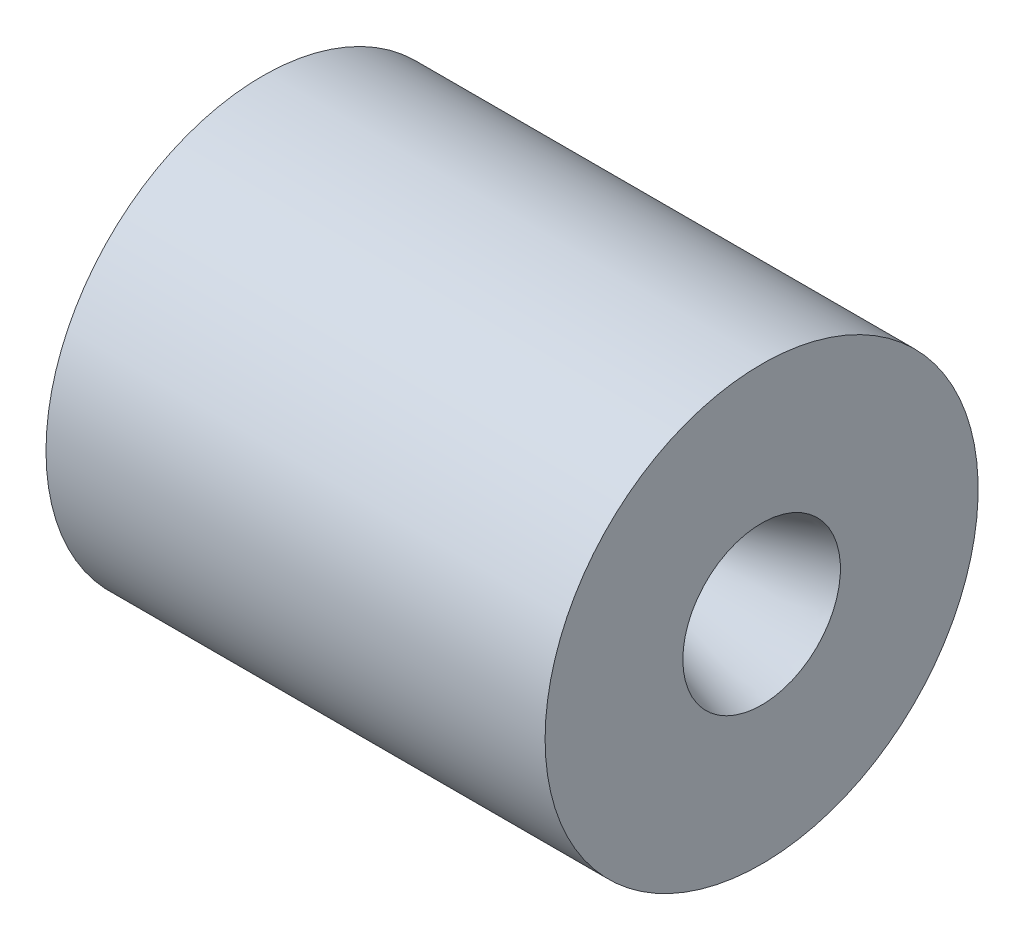
ISO-10303-21;
HEADER;
FILE_DESCRIPTION(('STEP AP214'),'2;1');
FILE_NAME('part.step','',(''),(''),'','','');
FILE_SCHEMA(('AUTOMOTIVE_DESIGN { 1 0 10303 214 1 1 1 1 }'));
ENDSEC;
DATA;
#1=APPLICATION_CONTEXT('core data for automotive mechanical design processes');
#2=APPLICATION_PROTOCOL_DEFINITION('international standard','automotive_design',2000,#1);
#3=PRODUCT_CONTEXT('',#1,'mechanical');
#4=PRODUCT('Part','Part','',(#3));
#5=PRODUCT_RELATED_PRODUCT_CATEGORY('part','',(#4));
#6=PRODUCT_DEFINITION_FORMATION('','',#4);
#7=PRODUCT_DEFINITION_CONTEXT('part definition',#1,'design');
#8=PRODUCT_DEFINITION('design','',#6,#7);
#9=PRODUCT_DEFINITION_SHAPE('','',#8);
#10=(LENGTH_UNIT() NAMED_UNIT(*) SI_UNIT(.MILLI.,.METRE.));
#11=(NAMED_UNIT(*) PLANE_ANGLE_UNIT() SI_UNIT($,.RADIAN.));
#12=(NAMED_UNIT(*) SI_UNIT($,.STERADIAN.) SOLID_ANGLE_UNIT());
#13=UNCERTAINTY_MEASURE_WITH_UNIT(LENGTH_MEASURE(1.E-05),#10,'distance_accuracy_value','');
#14=(GEOMETRIC_REPRESENTATION_CONTEXT(3) GLOBAL_UNCERTAINTY_ASSIGNED_CONTEXT((#13)) GLOBAL_UNIT_ASSIGNED_CONTEXT((#10,
#11,#12)) REPRESENTATION_CONTEXT('',''));
#15=CARTESIAN_POINT('',(0.,0.,0.));
#16=DIRECTION('',(0.,0.,1.));
#17=DIRECTION('',(1.,0.,0.));
#18=AXIS2_PLACEMENT_3D('',#15,#16,#17);
#19=CARTESIAN_POINT('',(0.,55.140272,0.));
#20=DIRECTION('',(1.,0.,0.));
#21=DIRECTION('',(0.,0.,-1.));
#22=AXIS2_PLACEMENT_3D('',#19,#20,#21);
#23=PLANE('',#22);
#24=CARTESIAN_POINT('',(0.,68.0005409151032,22.0947150978095));
#25=DIRECTION('',(-1.,0.,0.));
#26=DIRECTION('',(0.,0.,1.));
#27=AXIS2_PLACEMENT_3D('',#24,#25,#26);
#28=CIRCLE('',#27,2.57975099999999);
#29=CARTESIAN_POINT('',(0.,68.0005409151032,24.6744660978094));
#30=VERTEX_POINT('',#29);
#31=EDGE_CURVE('E114',#30,#30,#28,.T.);
#32=ORIENTED_EDGE('',*,*,#31,.F.);
#33=EDGE_LOOP('',(#32));
#34=FACE_BOUND('',#33,.T.);
#35=CARTESIAN_POINT('',(0.,71.1083155188316,-7.47378512363652));
#36=DIRECTION('',(-1.,0.,0.));
#37=DIRECTION('',(0.,0.,1.));
#38=AXIS2_PLACEMENT_3D('',#35,#36,#37);
#39=CIRCLE('',#38,2.57975099999999);
#40=CARTESIAN_POINT('',(0.,71.1083155188316,-4.89403412363653));
#41=VERTEX_POINT('',#40);
#42=EDGE_CURVE('E120',#41,#41,#39,.T.);
#43=ORIENTED_EDGE('',*,*,#42,.F.);
#44=EDGE_LOOP('',(#43));
#45=FACE_BOUND('',#44,.T.);
#46=CARTESIAN_POINT('',(0.,61.9208163705877,-35.7499999999994));
#47=DIRECTION('',(-1.,0.,0.));
#48=DIRECTION('',(0.,0.,1.));
#49=AXIS2_PLACEMENT_3D('',#46,#47,#48);
#50=CIRCLE('',#49,2.57975099999999);
#51=CARTESIAN_POINT('',(0.,61.9208163705877,-33.1702489999994));
#52=VERTEX_POINT('',#51);
#53=EDGE_CURVE('E126',#52,#52,#50,.T.);
#54=ORIENTED_EDGE('',*,*,#53,.F.);
#55=EDGE_LOOP('',(#54));
#56=FACE_BOUND('',#55,.T.);
#57=CARTESIAN_POINT('',(0.,42.0266455389123,-57.8447150978084));
#58=DIRECTION('',(-1.,0.,0.));
#59=DIRECTION('',(0.,0.,1.));
#60=AXIS2_PLACEMENT_3D('',#57,#58,#59);
#61=CIRCLE('',#60,2.57975099999999);
#62=CARTESIAN_POINT('',(0.,42.0266455389123,-55.2649640978084));
#63=VERTEX_POINT('',#62);
#64=EDGE_CURVE('E132',#63,#63,#61,.T.);
#65=ORIENTED_EDGE('',*,*,#64,.F.);
#66=EDGE_LOOP('',(#65));
#67=FACE_BOUND('',#66,.T.);
#68=CARTESIAN_POINT('',(0.,14.8656858934703,-69.937553452467));
#69=DIRECTION('',(-1.,0.,0.));
#70=DIRECTION('',(0.,0.,1.));
#71=AXIS2_PLACEMENT_3D('',#68,#69,#70);
#72=CIRCLE('',#71,2.57975099999999);
#73=CARTESIAN_POINT('',(0.,14.8656858934703,-67.357802452467));
#74=VERTEX_POINT('',#73);
#75=EDGE_CURVE('E138',#74,#74,#72,.T.);
#76=ORIENTED_EDGE('',*,*,#75,.F.);
#77=EDGE_LOOP('',(#76));
#78=FACE_BOUND('',#77,.T.);
#79=CARTESIAN_POINT('',(0.,-14.8656858934694,-69.9375534524672));
#80=DIRECTION('',(-1.,0.,0.));
#81=DIRECTION('',(0.,0.,1.));
#82=AXIS2_PLACEMENT_3D('',#79,#80,#81);
#83=CIRCLE('',#82,2.57975099999999);
#84=CARTESIAN_POINT('',(0.,-14.8656858934694,-67.3578024524672));
#85=VERTEX_POINT('',#84);
#86=EDGE_CURVE('E144',#85,#85,#83,.T.);
#87=ORIENTED_EDGE('',*,*,#86,.F.);
#88=EDGE_LOOP('',(#87));
#89=FACE_BOUND('',#88,.T.);
#90=CARTESIAN_POINT('',(0.,-42.0266455389115,-57.844715097809));
#91=DIRECTION('',(-1.,0.,0.));
#92=DIRECTION('',(0.,0.,1.));
#93=AXIS2_PLACEMENT_3D('',#90,#91,#92);
#94=CIRCLE('',#93,2.57975099999999);
#95=CARTESIAN_POINT('',(0.,-42.0266455389115,-55.264964097809));
#96=VERTEX_POINT('',#95);
#97=EDGE_CURVE('E150',#96,#96,#94,.T.);
#98=ORIENTED_EDGE('',*,*,#97,.F.);
#99=EDGE_LOOP('',(#98));
#100=FACE_BOUND('',#99,.T.);
#101=CARTESIAN_POINT('',(0.,-61.9208163705872,-35.7500000000003));
#102=DIRECTION('',(-1.,0.,0.));
#103=DIRECTION('',(0.,0.,1.));
#104=AXIS2_PLACEMENT_3D('',#101,#102,#103);
#105=CIRCLE('',#104,2.57975099999999);
#106=CARTESIAN_POINT('',(0.,-61.9208163705872,-33.1702490000003));
#107=VERTEX_POINT('',#106);
#108=EDGE_CURVE('E156',#107,#107,#105,.T.);
#109=ORIENTED_EDGE('',*,*,#108,.F.);
#110=EDGE_LOOP('',(#109));
#111=FACE_BOUND('',#110,.T.);
#112=CARTESIAN_POINT('',(0.,-71.1083155188315,-7.47378512363748));
#113=DIRECTION('',(-1.,0.,0.));
#114=DIRECTION('',(0.,0.,1.));
#115=AXIS2_PLACEMENT_3D('',#112,#113,#114);
#116=CIRCLE('',#115,2.57975099999999);
#117=CARTESIAN_POINT('',(0.,-71.1083155188315,-4.89403412363749));
#118=VERTEX_POINT('',#117);
#119=EDGE_CURVE('E162',#118,#118,#116,.T.);
#120=ORIENTED_EDGE('',*,*,#119,.F.);
#121=EDGE_LOOP('',(#120));
#122=FACE_BOUND('',#121,.T.);
#123=CARTESIAN_POINT('',(0.,-68.0005409151035,22.0947150978086));
#124=DIRECTION('',(-1.,0.,0.));
#125=DIRECTION('',(0.,0.,1.));
#126=AXIS2_PLACEMENT_3D('',#123,#124,#125);
#127=CIRCLE('',#126,2.57975099999999);
#128=CARTESIAN_POINT('',(0.,-68.0005409151035,24.6744660978086));
#129=VERTEX_POINT('',#128);
#130=EDGE_CURVE('E168',#129,#129,#127,.T.);
#131=ORIENTED_EDGE('',*,*,#130,.F.);
#132=EDGE_LOOP('',(#131));
#133=FACE_BOUND('',#132,.T.);
#134=CARTESIAN_POINT('',(0.,-53.1348550216338,47.8428383546583));
#135=DIRECTION('',(-1.,0.,0.));
#136=DIRECTION('',(0.,0.,1.));
#137=AXIS2_PLACEMENT_3D('',#134,#135,#136);
#138=CIRCLE('',#137,2.57975099999999);
#139=CARTESIAN_POINT('',(0.,-53.1348550216338,50.4225893546583));
#140=VERTEX_POINT('',#139);
#141=EDGE_CURVE('E174',#140,#140,#138,.T.);
#142=ORIENTED_EDGE('',*,*,#141,.F.);
#143=EDGE_LOOP('',(#142));
#144=FACE_BOUND('',#143,.T.);
#145=CARTESIAN_POINT('',(0.,-29.0816699799198,65.3185002214459));
#146=DIRECTION('',(-1.,0.,0.));
#147=DIRECTION('',(0.,0.,1.));
#148=AXIS2_PLACEMENT_3D('',#145,#146,#147);
#149=CIRCLE('',#148,2.57975099999999);
#150=CARTESIAN_POINT('',(0.,-29.0816699799198,67.8982512214459));
#151=VERTEX_POINT('',#150);
#152=EDGE_CURVE('E180',#151,#151,#149,.T.);
#153=ORIENTED_EDGE('',*,*,#152,.F.);
#154=EDGE_LOOP('',(#153));
#155=FACE_BOUND('',#154,.T.);
#156=CARTESIAN_POINT('',(0.,0.,71.5));
#157=DIRECTION('',(-1.,0.,0.));
#158=DIRECTION('',(0.,0.,1.));
#159=AXIS2_PLACEMENT_3D('',#156,#157,#158);
#160=CIRCLE('',#159,2.57975099999999);
#161=CARTESIAN_POINT('',(0.,0.,74.079751));
#162=VERTEX_POINT('',#161);
#163=EDGE_CURVE('E186',#162,#162,#160,.T.);
#164=ORIENTED_EDGE('',*,*,#163,.F.);
#165=EDGE_LOOP('',(#164));
#166=FACE_BOUND('',#165,.T.);
#167=CARTESIAN_POINT('',(0.,0.,0.));
#168=DIRECTION('',(-1.,0.,0.));
#169=DIRECTION('',(0.,0.,1.));
#170=AXIS2_PLACEMENT_3D('',#167,#168,#169);
#171=CIRCLE('',#170,55.140272);
#172=CARTESIAN_POINT('',(0.,0.,55.140272));
#173=VERTEX_POINT('',#172);
#174=EDGE_CURVE('E213',#173,#173,#171,.T.);
#175=ORIENTED_EDGE('',*,*,#174,.F.);
#176=EDGE_LOOP('',(#175));
#177=FACE_BOUND('',#176,.T.);
#178=CARTESIAN_POINT('',(0.,0.,0.));
#179=DIRECTION('',(-1.,0.,0.));
#180=DIRECTION('',(0.,0.,1.));
#181=AXIS2_PLACEMENT_3D('',#178,#179,#180);
#182=CIRCLE('',#181,80.540272);
#183=CARTESIAN_POINT('',(0.,0.,80.540272));
#184=VERTEX_POINT('',#183);
#185=EDGE_CURVE('E216',#184,#184,#182,.T.);
#186=ORIENTED_EDGE('',*,*,#185,.T.);
#187=EDGE_LOOP('',(#186));
#188=FACE_BOUND('',#187,.T.);
#189=CARTESIAN_POINT('',(0.,53.1348550216331,47.842838354659));
#190=DIRECTION('',(-1.,0.,0.));
#191=DIRECTION('',(0.,0.,1.));
#192=AXIS2_PLACEMENT_3D('',#189,#190,#191);
#193=CIRCLE('',#192,2.57975099999999);
#194=CARTESIAN_POINT('',(0.,53.1348550216331,50.422589354659));
#195=VERTEX_POINT('',#194);
#196=EDGE_CURVE('E103',#195,#195,#193,.T.);
#197=ORIENTED_EDGE('',*,*,#196,.F.);
#198=EDGE_LOOP('',(#197));
#199=FACE_BOUND('',#198,.T.);
#200=CARTESIAN_POINT('',(0.,29.0816699799189,65.3185002214463));
#201=DIRECTION('',(-1.,0.,0.));
#202=DIRECTION('',(0.,0.,1.));
#203=AXIS2_PLACEMENT_3D('',#200,#201,#202);
#204=CIRCLE('',#203,2.57975099999999);
#205=CARTESIAN_POINT('',(0.,29.0816699799189,67.8982512214463));
#206=VERTEX_POINT('',#205);
#207=EDGE_CURVE('E104',#206,#206,#204,.T.);
#208=ORIENTED_EDGE('',*,*,#207,.F.);
#209=EDGE_LOOP('',(#208));
#210=FACE_BOUND('',#209,.T.);
#211=ADVANCED_FACE('F38',(#34,#45,#56,#67,#78,#89,#100,#111,#122,#133,#144,#155,#166,#177,#188,
#199,#210),#23,.F.);
#212=CARTESIAN_POINT('',(140.608875713067,14.0680911814763,0.));
#213=CARTESIAN_POINT('',(181.460140895811,28.0308978195395,0.));
#214=CARTESIAN_POINT('',(185.649173895811,29.3102708195395,0.));
#215=B_SPLINE_CURVE_WITH_KNOTS('',2,(#212,#213,#214),.UNSPECIFIED.,.F.,.F.,(3,3),(0.,1.),.UNSPECIFIED.);
#216=CARTESIAN_POINT('',(0.,0.,0.));
#217=DIRECTION('',(-1.,0.,0.));
#218=AXIS1_PLACEMENT('',#216,#217);
#219=SURFACE_OF_REVOLUTION('',#215,#218);
#220=CARTESIAN_POINT('',(185.649173895811,0.,0.));
#221=DIRECTION('',(-1.,0.,0.));
#222=DIRECTION('',(0.,0.,1.));
#223=AXIS2_PLACEMENT_3D('',#220,#221,#222);
#224=CIRCLE('',#223,29.3102708195395);
#225=CARTESIAN_POINT('',(185.649173895811,0.,29.3102708195395));
#226=VERTEX_POINT('',#225);
#227=EDGE_CURVE('E11',#226,#226,#224,.T.);
#228=ORIENTED_EDGE('',*,*,#227,.F.);
#229=EDGE_LOOP('',(#228));
#230=FACE_BOUND('',#229,.T.);
#231=CARTESIAN_POINT('',(140.608875713067,0.,0.));
#232=DIRECTION('',(-1.,0.,0.));
#233=DIRECTION('',(0.,0.,1.));
#234=AXIS2_PLACEMENT_3D('',#231,#232,#233);
#235=CIRCLE('',#234,14.0680911814763);
#236=CARTESIAN_POINT('',(140.608875713067,0.,14.0680911814763));
#237=VERTEX_POINT('',#236);
#238=EDGE_CURVE('E191',#237,#237,#235,.T.);
#239=ORIENTED_EDGE('',*,*,#238,.T.);
#240=EDGE_LOOP('',(#239));
#241=FACE_BOUND('',#240,.T.);
#242=ADVANCED_FACE('F40',(#230,#241),#219,.T.);
#243=CARTESIAN_POINT('',(185.649173895811,80.540272,0.));
#244=DIRECTION('',(-1.,0.,0.));
#245=DIRECTION('',(0.,0.,1.));
#246=AXIS2_PLACEMENT_3D('',#243,#244,#245);
#247=PLANE('',#246);
#248=CARTESIAN_POINT('',(185.649173895811,0.,0.));
#249=DIRECTION('',(-1.,0.,0.));
#250=DIRECTION('',(0.,0.,1.));
#251=AXIS2_PLACEMENT_3D('',#248,#249,#250);
#252=CIRCLE('',#251,80.540272);
#253=CARTESIAN_POINT('',(185.649173895811,0.,80.540272));
#254=VERTEX_POINT('',#253);
#255=EDGE_CURVE('E47',#254,#254,#252,.T.);
#256=ORIENTED_EDGE('',*,*,#255,.F.);
#257=EDGE_LOOP('',(#256));
#258=FACE_BOUND('',#257,.T.);
#259=ORIENTED_EDGE('',*,*,#227,.T.);
#260=EDGE_LOOP('',(#259));
#261=FACE_BOUND('',#260,.T.);
#262=ADVANCED_FACE('F223',(#258,#261),#247,.F.);
#263=CARTESIAN_POINT('',(0.,0.,0.));
#264=DIRECTION('',(-1.,0.,0.));
#265=DIRECTION('',(0.,0.,1.));
#266=AXIS2_PLACEMENT_3D('',#263,#264,#265);
#267=CYLINDRICAL_SURFACE('',#266,80.540272);
#268=ORIENTED_EDGE('',*,*,#185,.F.);
#269=EDGE_LOOP('',(#268));
#270=FACE_BOUND('',#269,.T.);
#271=ORIENTED_EDGE('',*,*,#255,.T.);
#272=EDGE_LOOP('',(#271));
#273=FACE_BOUND('',#272,.T.);
#274=ADVANCED_FACE('F221',(#270,#273),#267,.T.);
#275=CARTESIAN_POINT('',(0.,0.,0.));
#276=DIRECTION('',(-1.,0.,0.));
#277=DIRECTION('',(0.,0.,1.));
#278=AXIS2_PLACEMENT_3D('',#275,#276,#277);
#279=CYLINDRICAL_SURFACE('',#278,55.140272);
#280=CARTESIAN_POINT('',(23.150958,0.,0.));
#281=DIRECTION('',(-1.,0.,0.));
#282=DIRECTION('',(0.,0.,1.));
#283=AXIS2_PLACEMENT_3D('',#280,#281,#282);
#284=CIRCLE('',#283,55.140272);
#285=CARTESIAN_POINT('',(23.150958,0.,55.140272));
#286=VERTEX_POINT('',#285);
#287=EDGE_CURVE('E210',#286,#286,#284,.T.);
#288=ORIENTED_EDGE('',*,*,#287,.F.);
#289=EDGE_LOOP('',(#288));
#290=FACE_BOUND('',#289,.T.);
#291=ORIENTED_EDGE('',*,*,#174,.T.);
#292=EDGE_LOOP('',(#291));
#293=FACE_BOUND('',#292,.T.);
#294=ADVANCED_FACE('F254',(#290,#293),#279,.F.);
#295=CARTESIAN_POINT('',(23.1509564613662,0.,0.));
#296=DIRECTION('',(-1.,0.,0.));
#297=DIRECTION('',(0.,0.,1.));
#298=AXIS2_PLACEMENT_3D('',#295,#296,#297);
#299=DEGENERATE_TOROIDAL_SURFACE('',#298,88.860648,144.00092,.F.);
#300=CARTESIAN_POINT('',(95.151418,0.,0.));
#301=DIRECTION('',(-1.,0.,0.));
#302=DIRECTION('',(0.,0.,1.));
#303=AXIS2_PLACEMENT_3D('',#300,#301,#302);
#304=CIRCLE('',#303,35.847806);
#305=CARTESIAN_POINT('',(95.151418,0.,35.847806));
#306=VERTEX_POINT('',#305);
#307=EDGE_CURVE('E207',#306,#306,#304,.T.);
#308=ORIENTED_EDGE('',*,*,#307,.F.);
#309=EDGE_LOOP('',(#308));
#310=FACE_BOUND('',#309,.T.);
#311=ORIENTED_EDGE('',*,*,#287,.T.);
#312=EDGE_LOOP('',(#311));
#313=FACE_BOUND('',#312,.T.);
#314=ADVANCED_FACE('F248',(#310,#313),#299,.T.);
#315=CARTESIAN_POINT('',(95.151418,0.,0.));
#316=DIRECTION('',(-1.,0.,0.));
#317=DIRECTION('',(0.,0.,1.));
#318=AXIS2_PLACEMENT_3D('',#315,#316,#317);
#319=CONICAL_SURFACE('',#318,35.847806,0.523598775598299);
#320=CARTESIAN_POINT('',(128.566947895811,0.,0.));
#321=DIRECTION('',(-1.,0.,0.));
#322=DIRECTION('',(0.,0.,1.));
#323=AXIS2_PLACEMENT_3D('',#320,#321,#322);
#324=CIRCLE('',#323,16.5553408195395);
#325=CARTESIAN_POINT('',(128.566947895811,0.,16.5553408195395));
#326=VERTEX_POINT('',#325);
#327=EDGE_CURVE('E204',#326,#326,#324,.T.);
#328=ORIENTED_EDGE('',*,*,#327,.F.);
#329=EDGE_LOOP('',(#328));
#330=FACE_BOUND('',#329,.T.);
#331=ORIENTED_EDGE('',*,*,#307,.T.);
#332=EDGE_LOOP('',(#331));
#333=FACE_BOUND('',#332,.T.);
#334=ADVANCED_FACE('F242',(#330,#333),#319,.F.);
#335=CARTESIAN_POINT('',(138.905748239959,0.,0.));
#336=DIRECTION('',(-1.,0.,0.));
#337=DIRECTION('',(0.,0.,1.));
#338=AXIS2_PLACEMENT_3D('',#335,#336,#337);
#339=TOROIDAL_SURFACE('',#338,34.4626698195395,20.677602);
#340=CARTESIAN_POINT('',(138.905748895811,0.,0.));
#341=DIRECTION('',(-1.,0.,0.));
#342=DIRECTION('',(0.,0.,1.));
#343=AXIS2_PLACEMENT_3D('',#340,#341,#342);
#344=CIRCLE('',#343,13.7850678195395);
#345=CARTESIAN_POINT('',(138.905748895811,0.,13.7850678195395));
#346=VERTEX_POINT('',#345);
#347=EDGE_CURVE('E201',#346,#346,#344,.T.);
#348=ORIENTED_EDGE('',*,*,#347,.F.);
#349=EDGE_LOOP('',(#348));
#350=FACE_BOUND('',#349,.T.);
#351=ORIENTED_EDGE('',*,*,#327,.T.);
#352=EDGE_LOOP('',(#351));
#353=FACE_BOUND('',#352,.T.);
#354=ADVANCED_FACE('F236',(#350,#353),#339,.T.);
#355=CARTESIAN_POINT('',(138.905748895811,0.,0.));
#356=DIRECTION('',(-1.,0.,0.));
#357=DIRECTION('',(0.,0.,1.));
#358=AXIS2_PLACEMENT_3D('',#355,#356,#357);
#359=TOROIDAL_SURFACE('',#358,19.0509638195395,5.265896);
#360=ORIENTED_EDGE('',*,*,#238,.F.);
#361=EDGE_LOOP('',(#360));
#362=FACE_BOUND('',#361,.T.);
#363=ORIENTED_EDGE('',*,*,#347,.T.);
#364=EDGE_LOOP('',(#363));
#365=FACE_BOUND('',#364,.T.);
#366=ADVANCED_FACE('F232',(#362,#365),#359,.T.);
#367=CARTESIAN_POINT('',(12.7,0.,71.5));
#368=DIRECTION('',(-1.,0.,0.));
#369=DIRECTION('',(0.,0.,1.));
#370=AXIS2_PLACEMENT_3D('',#367,#368,#369);
#371=CONICAL_SURFACE('',#370,2.57975099999999,1.02974425867665);
#372=CARTESIAN_POINT('',(14.250070782797,0.,71.5));
#373=VERTEX_POINT('',#372);
#374=VERTEX_LOOP('',#373);
#375=FACE_BOUND('',#374,.T.);
#376=CARTESIAN_POINT('',(12.7,0.,71.5));
#377=DIRECTION('',(-1.,0.,0.));
#378=DIRECTION('',(0.,0.,1.));
#379=AXIS2_PLACEMENT_3D('',#376,#377,#378);
#380=CIRCLE('',#379,2.57975099999999);
#381=CARTESIAN_POINT('',(12.7,0.,74.079751));
#382=VERTEX_POINT('',#381);
#383=EDGE_CURVE('E189',#382,#382,#380,.T.);
#384=ORIENTED_EDGE('',*,*,#383,.T.);
#385=EDGE_LOOP('',(#384));
#386=FACE_BOUND('',#385,.T.);
#387=ADVANCED_FACE('F235',(#375,#386),#371,.F.);
#388=CARTESIAN_POINT('',(0.,0.,71.5));
#389=DIRECTION('',(-1.,0.,0.));
#390=DIRECTION('',(0.,0.,1.));
#391=AXIS2_PLACEMENT_3D('',#388,#389,#390);
#392=CYLINDRICAL_SURFACE('',#391,2.57975099999999);
#393=ORIENTED_EDGE('',*,*,#383,.F.);
#394=EDGE_LOOP('',(#393));
#395=FACE_BOUND('',#394,.T.);
#396=ORIENTED_EDGE('',*,*,#163,.T.);
#397=EDGE_LOOP('',(#396));
#398=FACE_BOUND('',#397,.T.);
#399=ADVANCED_FACE('F380',(#395,#398),#392,.F.);
#400=CARTESIAN_POINT('',(12.7,-29.0816699799198,65.3185002214459));
#401=DIRECTION('',(-1.,0.,0.));
#402=DIRECTION('',(0.,0.,1.));
#403=AXIS2_PLACEMENT_3D('',#400,#401,#402);
#404=CONICAL_SURFACE('',#403,2.57975099999999,1.02974425867665);
#405=CARTESIAN_POINT('',(14.250070782797,-29.0816699799198,65.3185002214459));
#406=VERTEX_POINT('',#405);
#407=VERTEX_LOOP('',#406);
#408=FACE_BOUND('',#407,.T.);
#409=CARTESIAN_POINT('',(12.7,-29.0816699799198,65.3185002214459));
#410=DIRECTION('',(-1.,0.,0.));
#411=DIRECTION('',(0.,0.,1.));
#412=AXIS2_PLACEMENT_3D('',#409,#410,#411);
#413=CIRCLE('',#412,2.57975099999999);
#414=CARTESIAN_POINT('',(12.7,-29.0816699799198,67.8982512214459));
#415=VERTEX_POINT('',#414);
#416=EDGE_CURVE('E183',#415,#415,#413,.T.);
#417=ORIENTED_EDGE('',*,*,#416,.T.);
#418=EDGE_LOOP('',(#417));
#419=FACE_BOUND('',#418,.T.);
#420=ADVANCED_FACE('F376',(#408,#419),#404,.F.);
#421=CARTESIAN_POINT('',(0.,-29.0816699799198,65.3185002214459));
#422=DIRECTION('',(-1.,0.,0.));
#423=DIRECTION('',(0.,0.,1.));
#424=AXIS2_PLACEMENT_3D('',#421,#422,#423);
#425=CYLINDRICAL_SURFACE('',#424,2.57975099999999);
#426=ORIENTED_EDGE('',*,*,#416,.F.);
#427=EDGE_LOOP('',(#426));
#428=FACE_BOUND('',#427,.T.);
#429=ORIENTED_EDGE('',*,*,#152,.T.);
#430=EDGE_LOOP('',(#429));
#431=FACE_BOUND('',#430,.T.);
#432=ADVANCED_FACE('F372',(#428,#431),#425,.F.);
#433=CARTESIAN_POINT('',(12.7,-53.1348550216338,47.8428383546583));
#434=DIRECTION('',(-1.,0.,0.));
#435=DIRECTION('',(0.,0.,1.));
#436=AXIS2_PLACEMENT_3D('',#433,#434,#435);
#437=CONICAL_SURFACE('',#436,2.57975099999999,1.02974425867665);
#438=CARTESIAN_POINT('',(14.250070782797,-53.1348550216338,47.8428383546583));
#439=VERTEX_POINT('',#438);
#440=VERTEX_LOOP('',#439);
#441=FACE_BOUND('',#440,.T.);
#442=CARTESIAN_POINT('',(12.7,-53.1348550216338,47.8428383546583));
#443=DIRECTION('',(-1.,0.,0.));
#444=DIRECTION('',(0.,0.,1.));
#445=AXIS2_PLACEMENT_3D('',#442,#443,#444);
#446=CIRCLE('',#445,2.57975099999999);
#447=CARTESIAN_POINT('',(12.7,-53.1348550216338,50.4225893546583));
#448=VERTEX_POINT('',#447);
#449=EDGE_CURVE('E177',#448,#448,#446,.T.);
#450=ORIENTED_EDGE('',*,*,#449,.T.);
#451=EDGE_LOOP('',(#450));
#452=FACE_BOUND('',#451,.T.);
#453=ADVANCED_FACE('F368',(#441,#452),#437,.F.);
#454=CARTESIAN_POINT('',(0.,-53.1348550216338,47.8428383546583));
#455=DIRECTION('',(-1.,0.,0.));
#456=DIRECTION('',(0.,0.,1.));
#457=AXIS2_PLACEMENT_3D('',#454,#455,#456);
#458=CYLINDRICAL_SURFACE('',#457,2.57975099999999);
#459=ORIENTED_EDGE('',*,*,#449,.F.);
#460=EDGE_LOOP('',(#459));
#461=FACE_BOUND('',#460,.T.);
#462=ORIENTED_EDGE('',*,*,#141,.T.);
#463=EDGE_LOOP('',(#462));
#464=FACE_BOUND('',#463,.T.);
#465=ADVANCED_FACE('F364',(#461,#464),#458,.F.);
#466=CARTESIAN_POINT('',(12.7,-68.0005409151035,22.0947150978086));
#467=DIRECTION('',(-1.,0.,0.));
#468=DIRECTION('',(0.,0.,1.));
#469=AXIS2_PLACEMENT_3D('',#466,#467,#468);
#470=CONICAL_SURFACE('',#469,2.57975099999999,1.02974425867665);
#471=CARTESIAN_POINT('',(14.250070782797,-68.0005409151035,22.0947150978086));
#472=VERTEX_POINT('',#471);
#473=VERTEX_LOOP('',#472);
#474=FACE_BOUND('',#473,.T.);
#475=CARTESIAN_POINT('',(12.7,-68.0005409151035,22.0947150978086));
#476=DIRECTION('',(-1.,0.,0.));
#477=DIRECTION('',(0.,0.,1.));
#478=AXIS2_PLACEMENT_3D('',#475,#476,#477);
#479=CIRCLE('',#478,2.57975099999999);
#480=CARTESIAN_POINT('',(12.7,-68.0005409151035,24.6744660978086));
#481=VERTEX_POINT('',#480);
#482=EDGE_CURVE('E171',#481,#481,#479,.T.);
#483=ORIENTED_EDGE('',*,*,#482,.T.);
#484=EDGE_LOOP('',(#483));
#485=FACE_BOUND('',#484,.T.);
#486=ADVANCED_FACE('F360',(#474,#485),#470,.F.);
#487=CARTESIAN_POINT('',(0.,-68.0005409151035,22.0947150978086));
#488=DIRECTION('',(-1.,0.,0.));
#489=DIRECTION('',(0.,0.,1.));
#490=AXIS2_PLACEMENT_3D('',#487,#488,#489);
#491=CYLINDRICAL_SURFACE('',#490,2.57975099999999);
#492=ORIENTED_EDGE('',*,*,#482,.F.);
#493=EDGE_LOOP('',(#492));
#494=FACE_BOUND('',#493,.T.);
#495=ORIENTED_EDGE('',*,*,#130,.T.);
#496=EDGE_LOOP('',(#495));
#497=FACE_BOUND('',#496,.T.);
#498=ADVANCED_FACE('F356',(#494,#497),#491,.F.);
#499=CARTESIAN_POINT('',(12.7,-71.1083155188315,-7.47378512363748));
#500=DIRECTION('',(-1.,0.,0.));
#501=DIRECTION('',(0.,0.,1.));
#502=AXIS2_PLACEMENT_3D('',#499,#500,#501);
#503=CONICAL_SURFACE('',#502,2.57975099999999,1.02974425867665);
#504=CARTESIAN_POINT('',(14.250070782797,-71.1083155188315,-7.47378512363748));
#505=VERTEX_POINT('',#504);
#506=VERTEX_LOOP('',#505);
#507=FACE_BOUND('',#506,.T.);
#508=CARTESIAN_POINT('',(12.7,-71.1083155188315,-7.47378512363748));
#509=DIRECTION('',(-1.,0.,0.));
#510=DIRECTION('',(0.,0.,1.));
#511=AXIS2_PLACEMENT_3D('',#508,#509,#510);
#512=CIRCLE('',#511,2.57975099999999);
#513=CARTESIAN_POINT('',(12.7,-71.1083155188315,-4.89403412363749));
#514=VERTEX_POINT('',#513);
#515=EDGE_CURVE('E165',#514,#514,#512,.T.);
#516=ORIENTED_EDGE('',*,*,#515,.T.);
#517=EDGE_LOOP('',(#516));
#518=FACE_BOUND('',#517,.T.);
#519=ADVANCED_FACE('F352',(#507,#518),#503,.F.);
#520=CARTESIAN_POINT('',(0.,-71.1083155188315,-7.47378512363748));
#521=DIRECTION('',(-1.,0.,0.));
#522=DIRECTION('',(0.,0.,1.));
#523=AXIS2_PLACEMENT_3D('',#520,#521,#522);
#524=CYLINDRICAL_SURFACE('',#523,2.57975099999999);
#525=ORIENTED_EDGE('',*,*,#515,.F.);
#526=EDGE_LOOP('',(#525));
#527=FACE_BOUND('',#526,.T.);
#528=ORIENTED_EDGE('',*,*,#119,.T.);
#529=EDGE_LOOP('',(#528));
#530=FACE_BOUND('',#529,.T.);
#531=ADVANCED_FACE('F348',(#527,#530),#524,.F.);
#532=CARTESIAN_POINT('',(12.7,-61.9208163705872,-35.7500000000003));
#533=DIRECTION('',(-1.,0.,0.));
#534=DIRECTION('',(0.,0.,1.));
#535=AXIS2_PLACEMENT_3D('',#532,#533,#534);
#536=CONICAL_SURFACE('',#535,2.57975099999999,1.02974425867665);
#537=CARTESIAN_POINT('',(14.250070782797,-61.9208163705872,-35.7500000000003));
#538=VERTEX_POINT('',#537);
#539=VERTEX_LOOP('',#538);
#540=FACE_BOUND('',#539,.T.);
#541=CARTESIAN_POINT('',(12.7,-61.9208163705872,-35.7500000000003));
#542=DIRECTION('',(-1.,0.,0.));
#543=DIRECTION('',(0.,0.,1.));
#544=AXIS2_PLACEMENT_3D('',#541,#542,#543);
#545=CIRCLE('',#544,2.57975099999999);
#546=CARTESIAN_POINT('',(12.7,-61.9208163705872,-33.1702490000003));
#547=VERTEX_POINT('',#546);
#548=EDGE_CURVE('E159',#547,#547,#545,.T.);
#549=ORIENTED_EDGE('',*,*,#548,.T.);
#550=EDGE_LOOP('',(#549));
#551=FACE_BOUND('',#550,.T.);
#552=ADVANCED_FACE('F344',(#540,#551),#536,.F.);
#553=CARTESIAN_POINT('',(0.,-61.9208163705872,-35.7500000000003));
#554=DIRECTION('',(-1.,0.,0.));
#555=DIRECTION('',(0.,0.,1.));
#556=AXIS2_PLACEMENT_3D('',#553,#554,#555);
#557=CYLINDRICAL_SURFACE('',#556,2.57975099999999);
#558=ORIENTED_EDGE('',*,*,#548,.F.);
#559=EDGE_LOOP('',(#558));
#560=FACE_BOUND('',#559,.T.);
#561=ORIENTED_EDGE('',*,*,#108,.T.);
#562=EDGE_LOOP('',(#561));
#563=FACE_BOUND('',#562,.T.);
#564=ADVANCED_FACE('F340',(#560,#563),#557,.F.);
#565=CARTESIAN_POINT('',(12.7,-42.0266455389115,-57.844715097809));
#566=DIRECTION('',(-1.,0.,0.));
#567=DIRECTION('',(0.,0.,1.));
#568=AXIS2_PLACEMENT_3D('',#565,#566,#567);
#569=CONICAL_SURFACE('',#568,2.57975099999998,1.02974425867665);
#570=CARTESIAN_POINT('',(14.250070782797,-42.0266455389115,-57.844715097809));
#571=VERTEX_POINT('',#570);
#572=VERTEX_LOOP('',#571);
#573=FACE_BOUND('',#572,.T.);
#574=CARTESIAN_POINT('',(12.7,-42.0266455389115,-57.844715097809));
#575=DIRECTION('',(-1.,0.,0.));
#576=DIRECTION('',(0.,0.,1.));
#577=AXIS2_PLACEMENT_3D('',#574,#575,#576);
#578=CIRCLE('',#577,2.57975099999998);
#579=CARTESIAN_POINT('',(12.7,-42.0266455389115,-55.264964097809));
#580=VERTEX_POINT('',#579);
#581=EDGE_CURVE('E153',#580,#580,#578,.T.);
#582=ORIENTED_EDGE('',*,*,#581,.T.);
#583=EDGE_LOOP('',(#582));
#584=FACE_BOUND('',#583,.T.);
#585=ADVANCED_FACE('F336',(#573,#584),#569,.F.);
#586=CARTESIAN_POINT('',(0.,-42.0266455389115,-57.844715097809));
#587=DIRECTION('',(-1.,0.,0.));
#588=DIRECTION('',(0.,0.,1.));
#589=AXIS2_PLACEMENT_3D('',#586,#587,#588);
#590=CYLINDRICAL_SURFACE('',#589,2.57975099999999);
#591=ORIENTED_EDGE('',*,*,#581,.F.);
#592=EDGE_LOOP('',(#591));
#593=FACE_BOUND('',#592,.T.);
#594=ORIENTED_EDGE('',*,*,#97,.T.);
#595=EDGE_LOOP('',(#594));
#596=FACE_BOUND('',#595,.T.);
#597=ADVANCED_FACE('F332',(#593,#596),#590,.F.);
#598=CARTESIAN_POINT('',(12.7,-14.8656858934694,-69.9375534524672));
#599=DIRECTION('',(-1.,0.,0.));
#600=DIRECTION('',(0.,0.,1.));
#601=AXIS2_PLACEMENT_3D('',#598,#599,#600);
#602=CONICAL_SURFACE('',#601,2.57975099999999,1.02974425867665);
#603=CARTESIAN_POINT('',(14.250070782797,-14.8656858934694,-69.9375534524672));
#604=VERTEX_POINT('',#603);
#605=VERTEX_LOOP('',#604);
#606=FACE_BOUND('',#605,.T.);
#607=CARTESIAN_POINT('',(12.7,-14.8656858934694,-69.9375534524672));
#608=DIRECTION('',(-1.,0.,0.));
#609=DIRECTION('',(0.,0.,1.));
#610=AXIS2_PLACEMENT_3D('',#607,#608,#609);
#611=CIRCLE('',#610,2.57975099999999);
#612=CARTESIAN_POINT('',(12.7,-14.8656858934694,-67.3578024524672));
#613=VERTEX_POINT('',#612);
#614=EDGE_CURVE('E147',#613,#613,#611,.T.);
#615=ORIENTED_EDGE('',*,*,#614,.T.);
#616=EDGE_LOOP('',(#615));
#617=FACE_BOUND('',#616,.T.);
#618=ADVANCED_FACE('F328',(#606,#617),#602,.F.);
#619=CARTESIAN_POINT('',(0.,-14.8656858934694,-69.9375534524672));
#620=DIRECTION('',(-1.,0.,0.));
#621=DIRECTION('',(0.,0.,1.));
#622=AXIS2_PLACEMENT_3D('',#619,#620,#621);
#623=CYLINDRICAL_SURFACE('',#622,2.57975099999999);
#624=ORIENTED_EDGE('',*,*,#614,.F.);
#625=EDGE_LOOP('',(#624));
#626=FACE_BOUND('',#625,.T.);
#627=ORIENTED_EDGE('',*,*,#86,.T.);
#628=EDGE_LOOP('',(#627));
#629=FACE_BOUND('',#628,.T.);
#630=ADVANCED_FACE('F324',(#626,#629),#623,.F.);
#631=CARTESIAN_POINT('',(12.7,14.8656858934703,-69.937553452467));
#632=DIRECTION('',(-1.,0.,0.));
#633=DIRECTION('',(0.,0.,1.));
#634=AXIS2_PLACEMENT_3D('',#631,#632,#633);
#635=CONICAL_SURFACE('',#634,2.57975099999999,1.02974425867665);
#636=CARTESIAN_POINT('',(14.250070782797,14.8656858934703,-69.937553452467));
#637=VERTEX_POINT('',#636);
#638=VERTEX_LOOP('',#637);
#639=FACE_BOUND('',#638,.T.);
#640=CARTESIAN_POINT('',(12.7,14.8656858934703,-69.937553452467));
#641=DIRECTION('',(-1.,0.,0.));
#642=DIRECTION('',(0.,0.,1.));
#643=AXIS2_PLACEMENT_3D('',#640,#641,#642);
#644=CIRCLE('',#643,2.57975099999999);
#645=CARTESIAN_POINT('',(12.7,14.8656858934703,-67.357802452467));
#646=VERTEX_POINT('',#645);
#647=EDGE_CURVE('E141',#646,#646,#644,.T.);
#648=ORIENTED_EDGE('',*,*,#647,.T.);
#649=EDGE_LOOP('',(#648));
#650=FACE_BOUND('',#649,.T.);
#651=ADVANCED_FACE('F320',(#639,#650),#635,.F.);
#652=CARTESIAN_POINT('',(0.,14.8656858934703,-69.937553452467));
#653=DIRECTION('',(-1.,0.,0.));
#654=DIRECTION('',(0.,0.,1.));
#655=AXIS2_PLACEMENT_3D('',#652,#653,#654);
#656=CYLINDRICAL_SURFACE('',#655,2.57975099999999);
#657=ORIENTED_EDGE('',*,*,#647,.F.);
#658=EDGE_LOOP('',(#657));
#659=FACE_BOUND('',#658,.T.);
#660=ORIENTED_EDGE('',*,*,#75,.T.);
#661=EDGE_LOOP('',(#660));
#662=FACE_BOUND('',#661,.T.);
#663=ADVANCED_FACE('F316',(#659,#662),#656,.F.);
#664=CARTESIAN_POINT('',(12.7,42.0266455389123,-57.8447150978084));
#665=DIRECTION('',(-1.,0.,0.));
#666=DIRECTION('',(0.,0.,1.));
#667=AXIS2_PLACEMENT_3D('',#664,#665,#666);
#668=CONICAL_SURFACE('',#667,2.57975099999999,1.02974425867665);
#669=CARTESIAN_POINT('',(14.250070782797,42.0266455389123,-57.8447150978084));
#670=VERTEX_POINT('',#669);
#671=VERTEX_LOOP('',#670);
#672=FACE_BOUND('',#671,.T.);
#673=CARTESIAN_POINT('',(12.7,42.0266455389123,-57.8447150978084));
#674=DIRECTION('',(-1.,0.,0.));
#675=DIRECTION('',(0.,0.,1.));
#676=AXIS2_PLACEMENT_3D('',#673,#674,#675);
#677=CIRCLE('',#676,2.57975099999999);
#678=CARTESIAN_POINT('',(12.7,42.0266455389123,-55.2649640978084));
#679=VERTEX_POINT('',#678);
#680=EDGE_CURVE('E135',#679,#679,#677,.T.);
#681=ORIENTED_EDGE('',*,*,#680,.T.);
#682=EDGE_LOOP('',(#681));
#683=FACE_BOUND('',#682,.T.);
#684=ADVANCED_FACE('F312',(#672,#683),#668,.F.);
#685=CARTESIAN_POINT('',(0.,42.0266455389123,-57.8447150978084));
#686=DIRECTION('',(-1.,0.,0.));
#687=DIRECTION('',(0.,0.,1.));
#688=AXIS2_PLACEMENT_3D('',#685,#686,#687);
#689=CYLINDRICAL_SURFACE('',#688,2.57975099999999);
#690=ORIENTED_EDGE('',*,*,#680,.F.);
#691=EDGE_LOOP('',(#690));
#692=FACE_BOUND('',#691,.T.);
#693=ORIENTED_EDGE('',*,*,#64,.T.);
#694=EDGE_LOOP('',(#693));
#695=FACE_BOUND('',#694,.T.);
#696=ADVANCED_FACE('F308',(#692,#695),#689,.F.);
#697=CARTESIAN_POINT('',(12.7,61.9208163705877,-35.7499999999994));
#698=DIRECTION('',(-1.,0.,0.));
#699=DIRECTION('',(0.,0.,1.));
#700=AXIS2_PLACEMENT_3D('',#697,#698,#699);
#701=CONICAL_SURFACE('',#700,2.57975099999999,1.02974425867665);
#702=CARTESIAN_POINT('',(14.250070782797,61.9208163705877,-35.7499999999994));
#703=VERTEX_POINT('',#702);
#704=VERTEX_LOOP('',#703);
#705=FACE_BOUND('',#704,.T.);
#706=CARTESIAN_POINT('',(12.7,61.9208163705877,-35.7499999999994));
#707=DIRECTION('',(-1.,0.,0.));
#708=DIRECTION('',(0.,0.,1.));
#709=AXIS2_PLACEMENT_3D('',#706,#707,#708);
#710=CIRCLE('',#709,2.57975099999999);
#711=CARTESIAN_POINT('',(12.7,61.9208163705877,-33.1702489999994));
#712=VERTEX_POINT('',#711);
#713=EDGE_CURVE('E129',#712,#712,#710,.T.);
#714=ORIENTED_EDGE('',*,*,#713,.T.);
#715=EDGE_LOOP('',(#714));
#716=FACE_BOUND('',#715,.T.);
#717=ADVANCED_FACE('F304',(#705,#716),#701,.F.);
#718=CARTESIAN_POINT('',(0.,61.9208163705877,-35.7499999999994));
#719=DIRECTION('',(-1.,0.,0.));
#720=DIRECTION('',(0.,0.,1.));
#721=AXIS2_PLACEMENT_3D('',#718,#719,#720);
#722=CYLINDRICAL_SURFACE('',#721,2.57975099999999);
#723=ORIENTED_EDGE('',*,*,#713,.F.);
#724=EDGE_LOOP('',(#723));
#725=FACE_BOUND('',#724,.T.);
#726=ORIENTED_EDGE('',*,*,#53,.T.);
#727=EDGE_LOOP('',(#726));
#728=FACE_BOUND('',#727,.T.);
#729=ADVANCED_FACE('F300',(#725,#728),#722,.F.);
#730=CARTESIAN_POINT('',(12.7,71.1083155188316,-7.47378512363652));
#731=DIRECTION('',(-1.,0.,0.));
#732=DIRECTION('',(0.,0.,1.));
#733=AXIS2_PLACEMENT_3D('',#730,#731,#732);
#734=CONICAL_SURFACE('',#733,2.57975099999999,1.02974425867665);
#735=CARTESIAN_POINT('',(14.250070782797,71.1083155188316,-7.47378512363652));
#736=VERTEX_POINT('',#735);
#737=VERTEX_LOOP('',#736);
#738=FACE_BOUND('',#737,.T.);
#739=CARTESIAN_POINT('',(12.7,71.1083155188316,-7.47378512363652));
#740=DIRECTION('',(-1.,0.,0.));
#741=DIRECTION('',(0.,0.,1.));
#742=AXIS2_PLACEMENT_3D('',#739,#740,#741);
#743=CIRCLE('',#742,2.57975099999999);
#744=CARTESIAN_POINT('',(12.7,71.1083155188316,-4.89403412363653));
#745=VERTEX_POINT('',#744);
#746=EDGE_CURVE('E123',#745,#745,#743,.T.);
#747=ORIENTED_EDGE('',*,*,#746,.T.);
#748=EDGE_LOOP('',(#747));
#749=FACE_BOUND('',#748,.T.);
#750=ADVANCED_FACE('F296',(#738,#749),#734,.F.);
#751=CARTESIAN_POINT('',(0.,71.1083155188316,-7.47378512363652));
#752=DIRECTION('',(-1.,0.,0.));
#753=DIRECTION('',(0.,0.,1.));
#754=AXIS2_PLACEMENT_3D('',#751,#752,#753);
#755=CYLINDRICAL_SURFACE('',#754,2.57975099999999);
#756=ORIENTED_EDGE('',*,*,#746,.F.);
#757=EDGE_LOOP('',(#756));
#758=FACE_BOUND('',#757,.T.);
#759=ORIENTED_EDGE('',*,*,#42,.T.);
#760=EDGE_LOOP('',(#759));
#761=FACE_BOUND('',#760,.T.);
#762=ADVANCED_FACE('F292',(#758,#761),#755,.F.);
#763=CARTESIAN_POINT('',(12.7,68.0005409151032,22.0947150978095));
#764=DIRECTION('',(-1.,0.,0.));
#765=DIRECTION('',(0.,0.,1.));
#766=AXIS2_PLACEMENT_3D('',#763,#764,#765);
#767=CONICAL_SURFACE('',#766,2.57975099999999,1.02974425867665);
#768=CARTESIAN_POINT('',(14.250070782797,68.0005409151032,22.0947150978095));
#769=VERTEX_POINT('',#768);
#770=VERTEX_LOOP('',#769);
#771=FACE_BOUND('',#770,.T.);
#772=CARTESIAN_POINT('',(12.7,68.0005409151032,22.0947150978095));
#773=DIRECTION('',(-1.,0.,0.));
#774=DIRECTION('',(0.,0.,1.));
#775=AXIS2_PLACEMENT_3D('',#772,#773,#774);
#776=CIRCLE('',#775,2.57975099999999);
#777=CARTESIAN_POINT('',(12.7,68.0005409151032,24.6744660978094));
#778=VERTEX_POINT('',#777);
#779=EDGE_CURVE('E117',#778,#778,#776,.T.);
#780=ORIENTED_EDGE('',*,*,#779,.T.);
#781=EDGE_LOOP('',(#780));
#782=FACE_BOUND('',#781,.T.);
#783=ADVANCED_FACE('F288',(#771,#782),#767,.F.);
#784=CARTESIAN_POINT('',(0.,68.0005409151032,22.0947150978095));
#785=DIRECTION('',(-1.,0.,0.));
#786=DIRECTION('',(0.,0.,1.));
#787=AXIS2_PLACEMENT_3D('',#784,#785,#786);
#788=CYLINDRICAL_SURFACE('',#787,2.57975099999999);
#789=ORIENTED_EDGE('',*,*,#779,.F.);
#790=EDGE_LOOP('',(#789));
#791=FACE_BOUND('',#790,.T.);
#792=ORIENTED_EDGE('',*,*,#31,.T.);
#793=EDGE_LOOP('',(#792));
#794=FACE_BOUND('',#793,.T.);
#795=ADVANCED_FACE('F284',(#791,#794),#788,.F.);
#796=CARTESIAN_POINT('',(12.7,53.1348550216331,47.842838354659));
#797=DIRECTION('',(-1.,0.,0.));
#798=DIRECTION('',(0.,0.,1.));
#799=AXIS2_PLACEMENT_3D('',#796,#797,#798);
#800=CONICAL_SURFACE('',#799,2.57975099999998,1.02974425867665);
#801=CARTESIAN_POINT('',(14.250070782797,53.1348550216331,47.842838354659));
#802=VERTEX_POINT('',#801);
#803=VERTEX_LOOP('',#802);
#804=FACE_BOUND('',#803,.T.);
#805=CARTESIAN_POINT('',(12.7,53.1348550216331,47.842838354659));
#806=DIRECTION('',(-1.,0.,0.));
#807=DIRECTION('',(0.,0.,1.));
#808=AXIS2_PLACEMENT_3D('',#805,#806,#807);
#809=CIRCLE('',#808,2.57975099999998);
#810=CARTESIAN_POINT('',(12.7,53.1348550216331,50.422589354659));
#811=VERTEX_POINT('',#810);
#812=EDGE_CURVE('E107',#811,#811,#809,.T.);
#813=ORIENTED_EDGE('',*,*,#812,.T.);
#814=EDGE_LOOP('',(#813));
#815=FACE_BOUND('',#814,.T.);
#816=ADVANCED_FACE('F280',(#804,#815),#800,.F.);
#817=CARTESIAN_POINT('',(0.,53.1348550216331,47.842838354659));
#818=DIRECTION('',(-1.,0.,0.));
#819=DIRECTION('',(0.,0.,1.));
#820=AXIS2_PLACEMENT_3D('',#817,#818,#819);
#821=CYLINDRICAL_SURFACE('',#820,2.57975099999999);
#822=ORIENTED_EDGE('',*,*,#812,.F.);
#823=EDGE_LOOP('',(#822));
#824=FACE_BOUND('',#823,.T.);
#825=ORIENTED_EDGE('',*,*,#196,.T.);
#826=EDGE_LOOP('',(#825));
#827=FACE_BOUND('',#826,.T.);
#828=ADVANCED_FACE('F97',(#824,#827),#821,.F.);
#829=CARTESIAN_POINT('',(12.7,29.0816699799189,65.3185002214463));
#830=DIRECTION('',(-1.,0.,0.));
#831=DIRECTION('',(0.,0.,1.));
#832=AXIS2_PLACEMENT_3D('',#829,#830,#831);
#833=CONICAL_SURFACE('',#832,2.57975099999999,1.02974425867665);
#834=CARTESIAN_POINT('',(14.250070782797,29.0816699799189,65.3185002214463));
#835=VERTEX_POINT('',#834);
#836=VERTEX_LOOP('',#835);
#837=FACE_BOUND('',#836,.T.);
#838=CARTESIAN_POINT('',(12.7,29.0816699799189,65.3185002214463));
#839=DIRECTION('',(-1.,0.,0.));
#840=DIRECTION('',(0.,0.,1.));
#841=AXIS2_PLACEMENT_3D('',#838,#839,#840);
#842=CIRCLE('',#841,2.57975099999999);
#843=CARTESIAN_POINT('',(12.7,29.0816699799189,67.8982512214463));
#844=VERTEX_POINT('',#843);
#845=EDGE_CURVE('E101',#844,#844,#842,.T.);
#846=ORIENTED_EDGE('',*,*,#845,.T.);
#847=EDGE_LOOP('',(#846));
#848=FACE_BOUND('',#847,.T.);
#849=ADVANCED_FACE('F93',(#837,#848),#833,.F.);
#850=CARTESIAN_POINT('',(0.,29.0816699799189,65.3185002214463));
#851=DIRECTION('',(-1.,0.,0.));
#852=DIRECTION('',(0.,0.,1.));
#853=AXIS2_PLACEMENT_3D('',#850,#851,#852);
#854=CYLINDRICAL_SURFACE('',#853,2.57975099999999);
#855=ORIENTED_EDGE('',*,*,#845,.F.);
#856=EDGE_LOOP('',(#855));
#857=FACE_BOUND('',#856,.T.);
#858=ORIENTED_EDGE('',*,*,#207,.T.);
#859=EDGE_LOOP('',(#858));
#860=FACE_BOUND('',#859,.T.);
#861=ADVANCED_FACE('F96',(#857,#860),#854,.F.);
#862=CLOSED_SHELL('',(#211,#242,#262,#274,#294,#314,#334,#354,#366,#387,#399,#420,#432,#453,
#465,#486,#498,#519,#531,#552,#564,#585,#597,#618,#630,#651,#663,#684,#696,#717,#729,#750,#762,
#783,#795,#816,#828,#849,#861));
#863=MANIFOLD_SOLID_BREP('B2',#862);
#864=ADVANCED_BREP_SHAPE_REPRESENTATION('',(#18,#863),#14);
#865=SHAPE_DEFINITION_REPRESENTATION(#9,#864);
ENDSEC;
END-ISO-10303-21;
